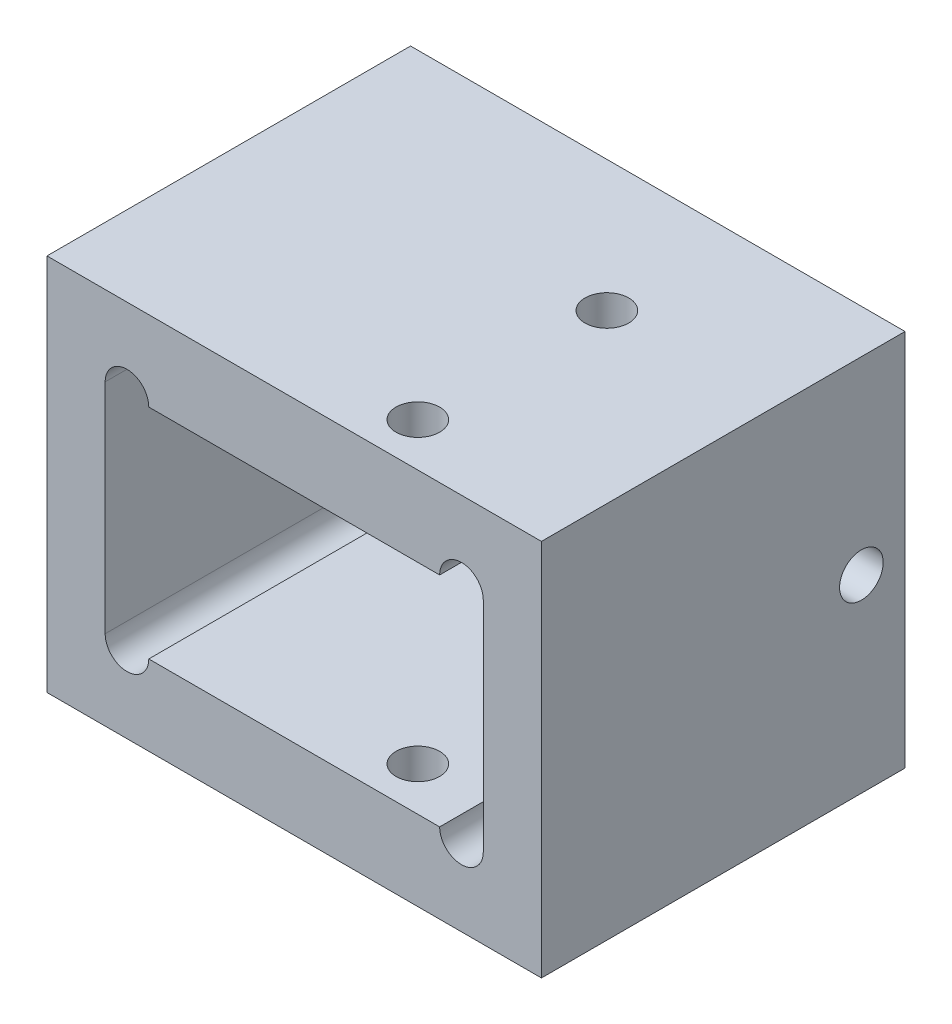
ISO-10303-21;
HEADER;
FILE_DESCRIPTION(('STEP AP214'),'2;1');
FILE_NAME('part.step','',(''),(''),'','','');
FILE_SCHEMA(('AUTOMOTIVE_DESIGN { 1 0 10303 214 1 1 1 1 }'));
ENDSEC;
DATA;
#1=APPLICATION_CONTEXT('core data for automotive mechanical design processes');
#2=APPLICATION_PROTOCOL_DEFINITION('international standard','automotive_design',2000,#1);
#3=PRODUCT_CONTEXT('',#1,'mechanical');
#4=PRODUCT('Part','Part','',(#3));
#5=PRODUCT_RELATED_PRODUCT_CATEGORY('part','',(#4));
#6=PRODUCT_DEFINITION_FORMATION('','',#4);
#7=PRODUCT_DEFINITION_CONTEXT('part definition',#1,'design');
#8=PRODUCT_DEFINITION('design','',#6,#7);
#9=PRODUCT_DEFINITION_SHAPE('','',#8);
#10=(LENGTH_UNIT() NAMED_UNIT(*) SI_UNIT(.MILLI.,.METRE.));
#11=(NAMED_UNIT(*) PLANE_ANGLE_UNIT() SI_UNIT($,.RADIAN.));
#12=(NAMED_UNIT(*) SI_UNIT($,.STERADIAN.) SOLID_ANGLE_UNIT());
#13=UNCERTAINTY_MEASURE_WITH_UNIT(LENGTH_MEASURE(1.E-05),#10,'distance_accuracy_value','');
#14=(GEOMETRIC_REPRESENTATION_CONTEXT(3) GLOBAL_UNCERTAINTY_ASSIGNED_CONTEXT((#13)) GLOBAL_UNIT_ASSIGNED_CONTEXT((#10,
#11,#12)) REPRESENTATION_CONTEXT('',''));
#15=CARTESIAN_POINT('',(0.,0.,0.));
#16=DIRECTION('',(0.,0.,1.));
#17=DIRECTION('',(1.,0.,0.));
#18=AXIS2_PLACEMENT_3D('',#15,#16,#17);
#19=CARTESIAN_POINT('',(0.,0.,25.));
#20=DIRECTION('',(0.,0.,-1.));
#21=DIRECTION('',(-1.,0.,0.));
#22=AXIS2_PLACEMENT_3D('',#19,#20,#21);
#23=PLANE('',#22);
#24=DIRECTION('',(-1.,0.,0.));
#25=VECTOR('',#24,1.);
#26=CARTESIAN_POINT('',(0.,13.,25.));
#27=LINE('',#26,#25);
#28=CARTESIAN_POINT('',(34.,13.,25.));
#29=VERTEX_POINT('',#28);
#30=CARTESIAN_POINT('',(0.,13.,25.));
#31=VERTEX_POINT('',#30);
#32=EDGE_CURVE('E192',#29,#31,#27,.T.);
#33=ORIENTED_EDGE('',*,*,#32,.T.);
#34=DIRECTION('',(0.,-1.,0.));
#35=VECTOR('',#34,1.);
#36=CARTESIAN_POINT('',(0.,-13.,25.));
#37=LINE('',#36,#35);
#38=CARTESIAN_POINT('',(0.,-13.,25.));
#39=VERTEX_POINT('',#38);
#40=EDGE_CURVE('E196',#31,#39,#37,.T.);
#41=ORIENTED_EDGE('',*,*,#40,.T.);
#42=DIRECTION('',(1.,0.,0.));
#43=VECTOR('',#42,1.);
#44=CARTESIAN_POINT('',(0.,-13.,25.));
#45=LINE('',#44,#43);
#46=CARTESIAN_POINT('',(34.,-13.,25.));
#47=VERTEX_POINT('',#46);
#48=EDGE_CURVE('E200',#39,#47,#45,.T.);
#49=ORIENTED_EDGE('',*,*,#48,.T.);
#50=DIRECTION('',(0.,1.,0.));
#51=VECTOR('',#50,1.);
#52=CARTESIAN_POINT('',(34.,13.,25.));
#53=LINE('',#52,#51);
#54=EDGE_CURVE('E203',#47,#29,#53,.T.);
#55=ORIENTED_EDGE('',*,*,#54,.T.);
#56=EDGE_LOOP('',(#33,#41,#49,#55));
#57=FACE_BOUND('',#56,.T.);
#58=DIRECTION('',(-1.,0.,0.));
#59=VECTOR('',#58,1.);
#60=CARTESIAN_POINT('',(4.,7.49999999999999,25.));
#61=LINE('',#60,#59);
#62=CARTESIAN_POINT('',(27.,7.49999999999999,25.));
#63=VERTEX_POINT('',#62);
#64=CARTESIAN_POINT('',(7.,7.49999999999999,25.));
#65=VERTEX_POINT('',#64);
#66=EDGE_CURVE('E157',#63,#65,#61,.T.);
#67=ORIENTED_EDGE('',*,*,#66,.F.);
#68=CARTESIAN_POINT('',(28.5,7.49999999999999,25.));
#69=DIRECTION('',(0.,0.,1.));
#70=DIRECTION('',(-1.,0.,0.));
#71=AXIS2_PLACEMENT_3D('',#68,#69,#70);
#72=CIRCLE('',#71,1.5);
#73=CARTESIAN_POINT('',(30.,7.49999999999999,25.));
#74=VERTEX_POINT('',#73);
#75=EDGE_CURVE('E58',#74,#63,#72,.T.);
#76=ORIENTED_EDGE('',*,*,#75,.F.);
#77=DIRECTION('',(0.,1.,0.));
#78=VECTOR('',#77,1.);
#79=CARTESIAN_POINT('',(30.,7.49999999999999,25.));
#80=LINE('',#79,#78);
#81=CARTESIAN_POINT('',(30.,-7.49999999999999,25.));
#82=VERTEX_POINT('',#81);
#83=EDGE_CURVE('E163',#82,#74,#80,.T.);
#84=ORIENTED_EDGE('',*,*,#83,.F.);
#85=CARTESIAN_POINT('',(28.5,-7.49999999999999,25.));
#86=DIRECTION('',(0.,0.,1.));
#87=DIRECTION('',(1.,0.,0.));
#88=AXIS2_PLACEMENT_3D('',#85,#86,#87);
#89=CIRCLE('',#88,1.5);
#90=CARTESIAN_POINT('',(27.,-7.49999999999999,25.));
#91=VERTEX_POINT('',#90);
#92=EDGE_CURVE('E275',#91,#82,#89,.T.);
#93=ORIENTED_EDGE('',*,*,#92,.F.);
#94=DIRECTION('',(1.,0.,0.));
#95=VECTOR('',#94,1.);
#96=CARTESIAN_POINT('',(4.,-7.49999999999999,25.));
#97=LINE('',#96,#95);
#98=CARTESIAN_POINT('',(7.,-7.49999999999999,25.));
#99=VERTEX_POINT('',#98);
#100=EDGE_CURVE('E150',#99,#91,#97,.T.);
#101=ORIENTED_EDGE('',*,*,#100,.F.);
#102=CARTESIAN_POINT('',(5.5,-7.49999999999999,25.));
#103=DIRECTION('',(0.,0.,1.));
#104=DIRECTION('',(-1.,0.,0.));
#105=AXIS2_PLACEMENT_3D('',#102,#103,#104);
#106=CIRCLE('',#105,1.5);
#107=CARTESIAN_POINT('',(4.,-7.49999999999999,25.));
#108=VERTEX_POINT('',#107);
#109=EDGE_CURVE('E66',#108,#99,#106,.T.);
#110=ORIENTED_EDGE('',*,*,#109,.F.);
#111=DIRECTION('',(0.,-1.,0.));
#112=VECTOR('',#111,1.);
#113=CARTESIAN_POINT('',(4.,-7.49999999999999,25.));
#114=LINE('',#113,#112);
#115=CARTESIAN_POINT('',(4.,7.49999999999999,25.));
#116=VERTEX_POINT('',#115);
#117=EDGE_CURVE('E147',#116,#108,#114,.T.);
#118=ORIENTED_EDGE('',*,*,#117,.F.);
#119=CARTESIAN_POINT('',(5.5,7.49999999999999,25.));
#120=DIRECTION('',(0.,0.,1.));
#121=DIRECTION('',(1.,0.,0.));
#122=AXIS2_PLACEMENT_3D('',#119,#120,#121);
#123=CIRCLE('',#122,1.5);
#124=EDGE_CURVE('E270',#65,#116,#123,.T.);
#125=ORIENTED_EDGE('',*,*,#124,.F.);
#126=EDGE_LOOP('',(#67,#76,#84,#93,#101,#110,#118,#125));
#127=FACE_BOUND('',#126,.T.);
#128=ADVANCED_FACE('F41',(#57,#127),#23,.F.);
#129=CARTESIAN_POINT('',(0.,0.,0.));
#130=DIRECTION('',(0.,0.,-1.));
#131=DIRECTION('',(-1.,0.,0.));
#132=AXIS2_PLACEMENT_3D('',#129,#130,#131);
#133=PLANE('',#132);
#134=CARTESIAN_POINT('',(28.5,7.49999999999999,0.));
#135=DIRECTION('',(0.,0.,1.));
#136=DIRECTION('',(-1.,0.,0.));
#137=AXIS2_PLACEMENT_3D('',#134,#135,#136);
#138=CIRCLE('',#137,1.5);
#139=CARTESIAN_POINT('',(30.,7.49999999999999,0.));
#140=VERTEX_POINT('',#139);
#141=CARTESIAN_POINT('',(27.,7.49999999999999,0.));
#142=VERTEX_POINT('',#141);
#143=EDGE_CURVE('E278',#140,#142,#138,.T.);
#144=ORIENTED_EDGE('',*,*,#143,.T.);
#145=DIRECTION('',(-1.,0.,0.));
#146=VECTOR('',#145,1.);
#147=CARTESIAN_POINT('',(4.,7.49999999999999,0.));
#148=LINE('',#147,#146);
#149=CARTESIAN_POINT('',(7.,7.49999999999999,0.));
#150=VERTEX_POINT('',#149);
#151=EDGE_CURVE('E171',#142,#150,#148,.T.);
#152=ORIENTED_EDGE('',*,*,#151,.T.);
#153=CARTESIAN_POINT('',(5.5,7.49999999999999,0.));
#154=DIRECTION('',(0.,0.,1.));
#155=DIRECTION('',(1.,0.,0.));
#156=AXIS2_PLACEMENT_3D('',#153,#154,#155);
#157=CIRCLE('',#156,1.5);
#158=CARTESIAN_POINT('',(4.,7.49999999999999,0.));
#159=VERTEX_POINT('',#158);
#160=EDGE_CURVE('E284',#150,#159,#157,.T.);
#161=ORIENTED_EDGE('',*,*,#160,.T.);
#162=DIRECTION('',(0.,-1.,0.));
#163=VECTOR('',#162,1.);
#164=CARTESIAN_POINT('',(4.,-7.49999999999999,0.));
#165=LINE('',#164,#163);
#166=CARTESIAN_POINT('',(4.,-7.49999999999999,0.));
#167=VERTEX_POINT('',#166);
#168=EDGE_CURVE('E176',#159,#167,#165,.T.);
#169=ORIENTED_EDGE('',*,*,#168,.T.);
#170=CARTESIAN_POINT('',(5.5,-7.49999999999999,0.));
#171=DIRECTION('',(0.,0.,1.));
#172=DIRECTION('',(-1.,0.,0.));
#173=AXIS2_PLACEMENT_3D('',#170,#171,#172);
#174=CIRCLE('',#173,1.5);
#175=CARTESIAN_POINT('',(7.,-7.49999999999999,0.));
#176=VERTEX_POINT('',#175);
#177=EDGE_CURVE('E133',#167,#176,#174,.T.);
#178=ORIENTED_EDGE('',*,*,#177,.T.);
#179=DIRECTION('',(1.,0.,0.));
#180=VECTOR('',#179,1.);
#181=CARTESIAN_POINT('',(4.,-7.49999999999999,0.));
#182=LINE('',#181,#180);
#183=CARTESIAN_POINT('',(27.,-7.49999999999999,0.));
#184=VERTEX_POINT('',#183);
#185=EDGE_CURVE('E179',#176,#184,#182,.T.);
#186=ORIENTED_EDGE('',*,*,#185,.T.);
#187=CARTESIAN_POINT('',(28.5,-7.49999999999999,0.));
#188=DIRECTION('',(0.,0.,1.));
#189=DIRECTION('',(1.,0.,0.));
#190=AXIS2_PLACEMENT_3D('',#187,#188,#189);
#191=CIRCLE('',#190,1.5);
#192=CARTESIAN_POINT('',(30.,-7.49999999999999,0.));
#193=VERTEX_POINT('',#192);
#194=EDGE_CURVE('E152',#184,#193,#191,.T.);
#195=ORIENTED_EDGE('',*,*,#194,.T.);
#196=DIRECTION('',(0.,1.,0.));
#197=VECTOR('',#196,1.);
#198=CARTESIAN_POINT('',(30.,7.49999999999999,0.));
#199=LINE('',#198,#197);
#200=EDGE_CURVE('E167',#193,#140,#199,.T.);
#201=ORIENTED_EDGE('',*,*,#200,.T.);
#202=EDGE_LOOP('',(#144,#152,#161,#169,#178,#186,#195,#201));
#203=FACE_BOUND('',#202,.T.);
#204=DIRECTION('',(-1.,0.,0.));
#205=VECTOR('',#204,1.);
#206=CARTESIAN_POINT('',(0.,13.,0.));
#207=LINE('',#206,#205);
#208=CARTESIAN_POINT('',(34.,13.,0.));
#209=VERTEX_POINT('',#208);
#210=CARTESIAN_POINT('',(0.,13.,0.));
#211=VERTEX_POINT('',#210);
#212=EDGE_CURVE('E191',#209,#211,#207,.T.);
#213=ORIENTED_EDGE('',*,*,#212,.F.);
#214=DIRECTION('',(0.,1.,0.));
#215=VECTOR('',#214,1.);
#216=CARTESIAN_POINT('',(34.,13.,0.));
#217=LINE('',#216,#215);
#218=CARTESIAN_POINT('',(34.,-13.,0.));
#219=VERTEX_POINT('',#218);
#220=EDGE_CURVE('E197',#219,#209,#217,.T.);
#221=ORIENTED_EDGE('',*,*,#220,.F.);
#222=DIRECTION('',(1.,0.,0.));
#223=VECTOR('',#222,1.);
#224=CARTESIAN_POINT('',(0.,-13.,0.));
#225=LINE('',#224,#223);
#226=CARTESIAN_POINT('',(0.,-13.,0.));
#227=VERTEX_POINT('',#226);
#228=EDGE_CURVE('E213',#227,#219,#225,.T.);
#229=ORIENTED_EDGE('',*,*,#228,.F.);
#230=DIRECTION('',(0.,-1.,0.));
#231=VECTOR('',#230,1.);
#232=CARTESIAN_POINT('',(0.,-13.,0.));
#233=LINE('',#232,#231);
#234=EDGE_CURVE('E210',#211,#227,#233,.T.);
#235=ORIENTED_EDGE('',*,*,#234,.F.);
#236=EDGE_LOOP('',(#213,#221,#229,#235));
#237=FACE_BOUND('',#236,.T.);
#238=ADVANCED_FACE('F304',(#203,#237),#133,.T.);
#239=CARTESIAN_POINT('',(0.,13.,25.));
#240=DIRECTION('',(0.,-1.,0.));
#241=DIRECTION('',(0.,0.,-1.));
#242=AXIS2_PLACEMENT_3D('',#239,#240,#241);
#243=PLANE('',#242);
#244=CARTESIAN_POINT('',(22.5,13.,22.));
#245=DIRECTION('',(0.,1.,0.));
#246=DIRECTION('',(0.,0.,1.));
#247=AXIS2_PLACEMENT_3D('',#244,#245,#246);
#248=CIRCLE('',#247,1.5);
#249=CARTESIAN_POINT('',(22.5,13.,23.5));
#250=VERTEX_POINT('',#249);
#251=EDGE_CURVE('E399',#250,#250,#248,.T.);
#252=ORIENTED_EDGE('',*,*,#251,.F.);
#253=EDGE_LOOP('',(#252));
#254=FACE_BOUND('',#253,.T.);
#255=CARTESIAN_POINT('',(22.5,13.,9.));
#256=DIRECTION('',(0.,1.,0.));
#257=DIRECTION('',(0.,0.,-1.));
#258=AXIS2_PLACEMENT_3D('',#255,#256,#257);
#259=CIRCLE('',#258,1.5);
#260=CARTESIAN_POINT('',(22.5,13.,7.5));
#261=VERTEX_POINT('',#260);
#262=EDGE_CURVE('E391',#261,#261,#259,.T.);
#263=ORIENTED_EDGE('',*,*,#262,.F.);
#264=EDGE_LOOP('',(#263));
#265=FACE_BOUND('',#264,.T.);
#266=ORIENTED_EDGE('',*,*,#212,.T.);
#267=DIRECTION('',(0.,0.,-1.));
#268=VECTOR('',#267,1.);
#269=CARTESIAN_POINT('',(0.,13.,25.));
#270=LINE('',#269,#268);
#271=EDGE_CURVE('E229',#31,#211,#270,.T.);
#272=ORIENTED_EDGE('',*,*,#271,.F.);
#273=ORIENTED_EDGE('',*,*,#32,.F.);
#274=DIRECTION('',(0.,0.,-1.));
#275=VECTOR('',#274,1.);
#276=CARTESIAN_POINT('',(34.,13.,25.));
#277=LINE('',#276,#275);
#278=EDGE_CURVE('E206',#29,#209,#277,.T.);
#279=ORIENTED_EDGE('',*,*,#278,.T.);
#280=EDGE_LOOP('',(#266,#272,#273,#279));
#281=FACE_BOUND('',#280,.T.);
#282=ADVANCED_FACE('F43',(#254,#265,#281),#243,.F.);
#283=CARTESIAN_POINT('',(0.,-13.,25.));
#284=DIRECTION('',(1.,0.,0.));
#285=DIRECTION('',(0.,0.,-1.));
#286=AXIS2_PLACEMENT_3D('',#283,#284,#285);
#287=PLANE('',#286);
#288=CARTESIAN_POINT('',(0.,0.,3.));
#289=DIRECTION('',(1.,0.,0.));
#290=DIRECTION('',(0.,0.,-1.));
#291=AXIS2_PLACEMENT_3D('',#288,#289,#290);
#292=CIRCLE('',#291,1.5);
#293=CARTESIAN_POINT('',(0.,0.,1.5));
#294=VERTEX_POINT('',#293);
#295=EDGE_CURVE('E351',#294,#294,#292,.T.);
#296=ORIENTED_EDGE('',*,*,#295,.T.);
#297=EDGE_LOOP('',(#296));
#298=FACE_BOUND('',#297,.T.);
#299=CARTESIAN_POINT('',(0.,0.,10.));
#300=DIRECTION('',(-1.,0.,0.));
#301=DIRECTION('',(0.,0.,1.));
#302=AXIS2_PLACEMENT_3D('',#299,#300,#301);
#303=CIRCLE('',#302,2.5);
#304=CARTESIAN_POINT('',(0.,0.,12.5));
#305=VERTEX_POINT('',#304);
#306=EDGE_CURVE('E252',#305,#305,#303,.T.);
#307=ORIENTED_EDGE('',*,*,#306,.F.);
#308=EDGE_LOOP('',(#307));
#309=FACE_BOUND('',#308,.T.);
#310=ORIENTED_EDGE('',*,*,#234,.T.);
#311=DIRECTION('',(0.,0.,-1.));
#312=VECTOR('',#311,1.);
#313=CARTESIAN_POINT('',(0.,-13.,25.));
#314=LINE('',#313,#312);
#315=EDGE_CURVE('E225',#39,#227,#314,.T.);
#316=ORIENTED_EDGE('',*,*,#315,.F.);
#317=ORIENTED_EDGE('',*,*,#40,.F.);
#318=ORIENTED_EDGE('',*,*,#271,.T.);
#319=EDGE_LOOP('',(#310,#316,#317,#318));
#320=FACE_BOUND('',#319,.T.);
#321=ADVANCED_FACE('F340',(#298,#309,#320),#287,.F.);
#322=CARTESIAN_POINT('',(0.,-13.,25.));
#323=DIRECTION('',(0.,1.,0.));
#324=DIRECTION('',(0.,0.,1.));
#325=AXIS2_PLACEMENT_3D('',#322,#323,#324);
#326=PLANE('',#325);
#327=CARTESIAN_POINT('',(22.5,-13.,22.));
#328=DIRECTION('',(0.,1.,0.));
#329=DIRECTION('',(0.,0.,1.));
#330=AXIS2_PLACEMENT_3D('',#327,#328,#329);
#331=CIRCLE('',#330,1.5);
#332=CARTESIAN_POINT('',(22.5,-13.,23.5));
#333=VERTEX_POINT('',#332);
#334=EDGE_CURVE('E242',#333,#333,#331,.T.);
#335=ORIENTED_EDGE('',*,*,#334,.T.);
#336=EDGE_LOOP('',(#335));
#337=FACE_BOUND('',#336,.T.);
#338=CARTESIAN_POINT('',(22.5,-13.,9.));
#339=DIRECTION('',(0.,1.,0.));
#340=DIRECTION('',(0.,0.,-1.));
#341=AXIS2_PLACEMENT_3D('',#338,#339,#340);
#342=CIRCLE('',#341,1.5);
#343=CARTESIAN_POINT('',(22.5,-13.,7.5));
#344=VERTEX_POINT('',#343);
#345=EDGE_CURVE('E259',#344,#344,#342,.T.);
#346=ORIENTED_EDGE('',*,*,#345,.T.);
#347=EDGE_LOOP('',(#346));
#348=FACE_BOUND('',#347,.T.);
#349=ORIENTED_EDGE('',*,*,#228,.T.);
#350=DIRECTION('',(0.,0.,-1.));
#351=VECTOR('',#350,1.);
#352=CARTESIAN_POINT('',(34.,-13.,25.));
#353=LINE('',#352,#351);
#354=EDGE_CURVE('E221',#47,#219,#353,.T.);
#355=ORIENTED_EDGE('',*,*,#354,.F.);
#356=ORIENTED_EDGE('',*,*,#48,.F.);
#357=ORIENTED_EDGE('',*,*,#315,.T.);
#358=EDGE_LOOP('',(#349,#355,#356,#357));
#359=FACE_BOUND('',#358,.T.);
#360=ADVANCED_FACE('F337',(#337,#348,#359),#326,.F.);
#361=CARTESIAN_POINT('',(34.,13.,25.));
#362=DIRECTION('',(-1.,0.,0.));
#363=DIRECTION('',(0.,0.,1.));
#364=AXIS2_PLACEMENT_3D('',#361,#362,#363);
#365=PLANE('',#364);
#366=CARTESIAN_POINT('',(34.,0.,3.));
#367=DIRECTION('',(1.,0.,0.));
#368=DIRECTION('',(0.,0.,-1.));
#369=AXIS2_PLACEMENT_3D('',#366,#367,#368);
#370=CIRCLE('',#369,1.5);
#371=CARTESIAN_POINT('',(34.,0.,1.5));
#372=VERTEX_POINT('',#371);
#373=EDGE_CURVE('E393',#372,#372,#370,.T.);
#374=ORIENTED_EDGE('',*,*,#373,.F.);
#375=EDGE_LOOP('',(#374));
#376=FACE_BOUND('',#375,.T.);
#377=ORIENTED_EDGE('',*,*,#220,.T.);
#378=ORIENTED_EDGE('',*,*,#278,.F.);
#379=ORIENTED_EDGE('',*,*,#54,.F.);
#380=ORIENTED_EDGE('',*,*,#354,.T.);
#381=EDGE_LOOP('',(#377,#378,#379,#380));
#382=FACE_BOUND('',#381,.T.);
#383=ADVANCED_FACE('F334',(#376,#382),#365,.F.);
#384=CARTESIAN_POINT('',(30.,7.49999999999999,25.));
#385=DIRECTION('',(-1.,0.,0.));
#386=DIRECTION('',(0.,0.,1.));
#387=AXIS2_PLACEMENT_3D('',#384,#385,#386);
#388=PLANE('',#387);
#389=CARTESIAN_POINT('',(30.,0.,3.));
#390=DIRECTION('',(-1.,0.,0.));
#391=DIRECTION('',(0.,0.,1.));
#392=AXIS2_PLACEMENT_3D('',#389,#390,#391);
#393=CIRCLE('',#392,1.5);
#394=CARTESIAN_POINT('',(30.,0.,4.5));
#395=VERTEX_POINT('',#394);
#396=EDGE_CURVE('E387',#395,#395,#393,.T.);
#397=ORIENTED_EDGE('',*,*,#396,.F.);
#398=EDGE_LOOP('',(#397));
#399=FACE_BOUND('',#398,.T.);
#400=ORIENTED_EDGE('',*,*,#200,.F.);
#401=DIRECTION('',(0.,0.,-1.));
#402=VECTOR('',#401,1.);
#403=CARTESIAN_POINT('',(30.,-7.49999999999999,25.));
#404=LINE('',#403,#402);
#405=EDGE_CURVE('E140',#82,#193,#404,.T.);
#406=ORIENTED_EDGE('',*,*,#405,.F.);
#407=ORIENTED_EDGE('',*,*,#83,.T.);
#408=DIRECTION('',(0.,0.,-1.));
#409=VECTOR('',#408,1.);
#410=CARTESIAN_POINT('',(30.,7.49999999999999,25.));
#411=LINE('',#410,#409);
#412=EDGE_CURVE('E187',#74,#140,#411,.T.);
#413=ORIENTED_EDGE('',*,*,#412,.T.);
#414=EDGE_LOOP('',(#400,#406,#407,#413));
#415=FACE_BOUND('',#414,.T.);
#416=ADVANCED_FACE('F297',(#399,#415),#388,.T.);
#417=CARTESIAN_POINT('',(4.,7.49999999999999,25.));
#418=DIRECTION('',(0.,-1.,0.));
#419=DIRECTION('',(0.,0.,-1.));
#420=AXIS2_PLACEMENT_3D('',#417,#418,#419);
#421=PLANE('',#420);
#422=CARTESIAN_POINT('',(22.5,7.49999999999999,22.));
#423=DIRECTION('',(0.,-1.,0.));
#424=DIRECTION('',(0.,0.,-1.));
#425=AXIS2_PLACEMENT_3D('',#422,#423,#424);
#426=CIRCLE('',#425,1.5);
#427=CARTESIAN_POINT('',(22.5,7.49999999999999,20.5));
#428=VERTEX_POINT('',#427);
#429=EDGE_CURVE('E246',#428,#428,#426,.T.);
#430=ORIENTED_EDGE('',*,*,#429,.F.);
#431=EDGE_LOOP('',(#430));
#432=FACE_BOUND('',#431,.T.);
#433=CARTESIAN_POINT('',(22.5,7.49999999999999,9.));
#434=DIRECTION('',(0.,-1.,0.));
#435=DIRECTION('',(0.,0.,-1.));
#436=AXIS2_PLACEMENT_3D('',#433,#434,#435);
#437=CIRCLE('',#436,1.5);
#438=CARTESIAN_POINT('',(22.5,7.49999999999999,7.5));
#439=VERTEX_POINT('',#438);
#440=EDGE_CURVE('E241',#439,#439,#437,.T.);
#441=ORIENTED_EDGE('',*,*,#440,.F.);
#442=EDGE_LOOP('',(#441));
#443=FACE_BOUND('',#442,.T.);
#444=DIRECTION('',(0.,0.,1.));
#445=VECTOR('',#444,1.);
#446=CARTESIAN_POINT('',(27.,7.49999999999999,0.));
#447=LINE('',#446,#445);
#448=EDGE_CURVE('E11',#63,#142,#447,.F.);
#449=ORIENTED_EDGE('',*,*,#448,.F.);
#450=ORIENTED_EDGE('',*,*,#66,.T.);
#451=DIRECTION('',(0.,0.,1.));
#452=VECTOR('',#451,1.);
#453=CARTESIAN_POINT('',(7.,7.49999999999999,0.));
#454=LINE('',#453,#452);
#455=EDGE_CURVE('E172',#150,#65,#454,.T.);
#456=ORIENTED_EDGE('',*,*,#455,.F.);
#457=ORIENTED_EDGE('',*,*,#151,.F.);
#458=EDGE_LOOP('',(#449,#450,#456,#457));
#459=FACE_BOUND('',#458,.T.);
#460=ADVANCED_FACE('F300',(#432,#443,#459),#421,.T.);
#461=CARTESIAN_POINT('',(4.,-7.49999999999999,25.));
#462=DIRECTION('',(1.,0.,0.));
#463=DIRECTION('',(0.,0.,-1.));
#464=AXIS2_PLACEMENT_3D('',#461,#462,#463);
#465=PLANE('',#464);
#466=CARTESIAN_POINT('',(4.,0.,3.));
#467=DIRECTION('',(1.,0.,0.));
#468=DIRECTION('',(0.,0.,-1.));
#469=AXIS2_PLACEMENT_3D('',#466,#467,#468);
#470=CIRCLE('',#469,1.5);
#471=CARTESIAN_POINT('',(4.,0.,1.5));
#472=VERTEX_POINT('',#471);
#473=EDGE_CURVE('E45',#472,#472,#470,.T.);
#474=ORIENTED_EDGE('',*,*,#473,.F.);
#475=EDGE_LOOP('',(#474));
#476=FACE_BOUND('',#475,.T.);
#477=CARTESIAN_POINT('',(4.,0.,10.));
#478=DIRECTION('',(1.,0.,0.));
#479=DIRECTION('',(0.,0.,-1.));
#480=AXIS2_PLACEMENT_3D('',#477,#478,#479);
#481=CIRCLE('',#480,2.5);
#482=CARTESIAN_POINT('',(4.,0.,7.5));
#483=VERTEX_POINT('',#482);
#484=EDGE_CURVE('E265',#483,#483,#481,.F.);
#485=ORIENTED_EDGE('',*,*,#484,.T.);
#486=EDGE_LOOP('',(#485));
#487=FACE_BOUND('',#486,.T.);
#488=ORIENTED_EDGE('',*,*,#168,.F.);
#489=DIRECTION('',(0.,0.,-1.));
#490=VECTOR('',#489,1.);
#491=CARTESIAN_POINT('',(4.,7.49999999999999,25.));
#492=LINE('',#491,#490);
#493=EDGE_CURVE('E139',#116,#159,#492,.T.);
#494=ORIENTED_EDGE('',*,*,#493,.F.);
#495=ORIENTED_EDGE('',*,*,#117,.T.);
#496=DIRECTION('',(0.,0.,-1.));
#497=VECTOR('',#496,1.);
#498=CARTESIAN_POINT('',(4.,-7.49999999999999,25.));
#499=LINE('',#498,#497);
#500=EDGE_CURVE('E130',#108,#167,#499,.T.);
#501=ORIENTED_EDGE('',*,*,#500,.T.);
#502=EDGE_LOOP('',(#488,#494,#495,#501));
#503=FACE_BOUND('',#502,.T.);
#504=ADVANCED_FACE('F155',(#476,#487,#503),#465,.T.);
#505=CARTESIAN_POINT('',(4.,-7.49999999999999,25.));
#506=DIRECTION('',(0.,1.,0.));
#507=DIRECTION('',(0.,0.,1.));
#508=AXIS2_PLACEMENT_3D('',#505,#506,#507);
#509=PLANE('',#508);
#510=CARTESIAN_POINT('',(22.5,-7.49999999999999,22.));
#511=DIRECTION('',(0.,1.,0.));
#512=DIRECTION('',(0.,0.,1.));
#513=AXIS2_PLACEMENT_3D('',#510,#511,#512);
#514=CIRCLE('',#513,1.5);
#515=CARTESIAN_POINT('',(22.5,-7.49999999999999,23.5));
#516=VERTEX_POINT('',#515);
#517=EDGE_CURVE('E243',#516,#516,#514,.T.);
#518=ORIENTED_EDGE('',*,*,#517,.F.);
#519=EDGE_LOOP('',(#518));
#520=FACE_BOUND('',#519,.T.);
#521=CARTESIAN_POINT('',(22.5,-7.49999999999999,9.));
#522=DIRECTION('',(0.,1.,0.));
#523=DIRECTION('',(0.,0.,1.));
#524=AXIS2_PLACEMENT_3D('',#521,#522,#523);
#525=CIRCLE('',#524,1.5);
#526=CARTESIAN_POINT('',(22.5,-7.49999999999999,10.5));
#527=VERTEX_POINT('',#526);
#528=EDGE_CURVE('E238',#527,#527,#525,.T.);
#529=ORIENTED_EDGE('',*,*,#528,.F.);
#530=EDGE_LOOP('',(#529));
#531=FACE_BOUND('',#530,.T.);
#532=DIRECTION('',(0.,0.,1.));
#533=VECTOR('',#532,1.);
#534=CARTESIAN_POINT('',(27.,-7.49999999999999,0.));
#535=LINE('',#534,#533);
#536=EDGE_CURVE('E51',#184,#91,#535,.T.);
#537=ORIENTED_EDGE('',*,*,#536,.F.);
#538=ORIENTED_EDGE('',*,*,#185,.F.);
#539=DIRECTION('',(0.,0.,1.));
#540=VECTOR('',#539,1.);
#541=CARTESIAN_POINT('',(7.,-7.49999999999999,0.));
#542=LINE('',#541,#540);
#543=EDGE_CURVE('E233',#99,#176,#542,.F.);
#544=ORIENTED_EDGE('',*,*,#543,.F.);
#545=ORIENTED_EDGE('',*,*,#100,.T.);
#546=EDGE_LOOP('',(#537,#538,#544,#545));
#547=FACE_BOUND('',#546,.T.);
#548=ADVANCED_FACE('F311',(#520,#531,#547),#509,.T.);
#549=CARTESIAN_POINT('',(5.5,-7.49999999999999,0.));
#550=DIRECTION('',(0.,0.,1.));
#551=DIRECTION('',(1.,0.,0.));
#552=AXIS2_PLACEMENT_3D('',#549,#550,#551);
#553=CYLINDRICAL_SURFACE('',#552,1.5);
#554=ORIENTED_EDGE('',*,*,#500,.F.);
#555=ORIENTED_EDGE('',*,*,#109,.T.);
#556=ORIENTED_EDGE('',*,*,#543,.T.);
#557=ORIENTED_EDGE('',*,*,#177,.F.);
#558=EDGE_LOOP('',(#554,#555,#556,#557));
#559=FACE_BOUND('',#558,.T.);
#560=ADVANCED_FACE('F131',(#559),#553,.F.);
#561=CARTESIAN_POINT('',(28.5,-7.49999999999999,0.));
#562=DIRECTION('',(0.,0.,1.));
#563=DIRECTION('',(1.,0.,0.));
#564=AXIS2_PLACEMENT_3D('',#561,#562,#563);
#565=CYLINDRICAL_SURFACE('',#564,1.5);
#566=ORIENTED_EDGE('',*,*,#536,.T.);
#567=ORIENTED_EDGE('',*,*,#92,.T.);
#568=ORIENTED_EDGE('',*,*,#405,.T.);
#569=ORIENTED_EDGE('',*,*,#194,.F.);
#570=EDGE_LOOP('',(#566,#567,#568,#569));
#571=FACE_BOUND('',#570,.T.);
#572=ADVANCED_FACE('F309',(#571),#565,.F.);
#573=CARTESIAN_POINT('',(5.5,7.49999999999999,0.));
#574=DIRECTION('',(0.,0.,1.));
#575=DIRECTION('',(1.,0.,0.));
#576=AXIS2_PLACEMENT_3D('',#573,#574,#575);
#577=CYLINDRICAL_SURFACE('',#576,1.5);
#578=ORIENTED_EDGE('',*,*,#455,.T.);
#579=ORIENTED_EDGE('',*,*,#124,.T.);
#580=ORIENTED_EDGE('',*,*,#493,.T.);
#581=ORIENTED_EDGE('',*,*,#160,.F.);
#582=EDGE_LOOP('',(#578,#579,#580,#581));
#583=FACE_BOUND('',#582,.T.);
#584=ADVANCED_FACE('F313',(#583),#577,.F.);
#585=CARTESIAN_POINT('',(28.5,7.49999999999999,0.));
#586=DIRECTION('',(0.,0.,1.));
#587=DIRECTION('',(1.,0.,0.));
#588=AXIS2_PLACEMENT_3D('',#585,#586,#587);
#589=CYLINDRICAL_SURFACE('',#588,1.5);
#590=ORIENTED_EDGE('',*,*,#412,.F.);
#591=ORIENTED_EDGE('',*,*,#75,.T.);
#592=ORIENTED_EDGE('',*,*,#448,.T.);
#593=ORIENTED_EDGE('',*,*,#143,.F.);
#594=EDGE_LOOP('',(#590,#591,#592,#593));
#595=FACE_BOUND('',#594,.T.);
#596=ADVANCED_FACE('F302',(#595),#589,.F.);
#597=CARTESIAN_POINT('',(11.0710678118655,0.,10.));
#598=DIRECTION('',(-1.,0.,0.));
#599=DIRECTION('',(0.,0.,1.));
#600=AXIS2_PLACEMENT_3D('',#597,#598,#599);
#601=CYLINDRICAL_SURFACE('',#600,2.5);
#602=ORIENTED_EDGE('',*,*,#306,.T.);
#603=EDGE_LOOP('',(#602));
#604=FACE_BOUND('',#603,.T.);
#605=ORIENTED_EDGE('',*,*,#484,.F.);
#606=EDGE_LOOP('',(#605));
#607=FACE_BOUND('',#606,.T.);
#608=ADVANCED_FACE('F320',(#604,#607),#601,.F.);
#609=CARTESIAN_POINT('',(22.5,-13.,9.));
#610=DIRECTION('',(0.,1.,0.));
#611=DIRECTION('',(0.,0.,1.));
#612=AXIS2_PLACEMENT_3D('',#609,#610,#611);
#613=CYLINDRICAL_SURFACE('',#612,1.5);
#614=ORIENTED_EDGE('',*,*,#528,.T.);
#615=EDGE_LOOP('',(#614));
#616=FACE_BOUND('',#615,.T.);
#617=ORIENTED_EDGE('',*,*,#345,.F.);
#618=EDGE_LOOP('',(#617));
#619=FACE_BOUND('',#618,.T.);
#620=ADVANCED_FACE('F370',(#616,#619),#613,.F.);
#621=CARTESIAN_POINT('',(22.5,-13.,22.));
#622=DIRECTION('',(0.,1.,0.));
#623=DIRECTION('',(0.,0.,1.));
#624=AXIS2_PLACEMENT_3D('',#621,#622,#623);
#625=CYLINDRICAL_SURFACE('',#624,1.5);
#626=ORIENTED_EDGE('',*,*,#517,.T.);
#627=EDGE_LOOP('',(#626));
#628=FACE_BOUND('',#627,.T.);
#629=ORIENTED_EDGE('',*,*,#334,.F.);
#630=EDGE_LOOP('',(#629));
#631=FACE_BOUND('',#630,.T.);
#632=ADVANCED_FACE('F415',(#628,#631),#625,.F.);
#633=ORIENTED_EDGE('',*,*,#440,.T.);
#634=EDGE_LOOP('',(#633));
#635=FACE_BOUND('',#634,.T.);
#636=ORIENTED_EDGE('',*,*,#262,.T.);
#637=EDGE_LOOP('',(#636));
#638=FACE_BOUND('',#637,.T.);
#639=ADVANCED_FACE('F418',(#635,#638),#613,.F.);
#640=ORIENTED_EDGE('',*,*,#429,.T.);
#641=EDGE_LOOP('',(#640));
#642=FACE_BOUND('',#641,.T.);
#643=ORIENTED_EDGE('',*,*,#251,.T.);
#644=EDGE_LOOP('',(#643));
#645=FACE_BOUND('',#644,.T.);
#646=ADVANCED_FACE('F423',(#642,#645),#625,.F.);
#647=CARTESIAN_POINT('',(0.,0.,3.));
#648=DIRECTION('',(1.,0.,0.));
#649=DIRECTION('',(0.,0.,-1.));
#650=AXIS2_PLACEMENT_3D('',#647,#648,#649);
#651=CYLINDRICAL_SURFACE('',#650,1.5);
#652=ORIENTED_EDGE('',*,*,#473,.T.);
#653=EDGE_LOOP('',(#652));
#654=FACE_BOUND('',#653,.T.);
#655=ORIENTED_EDGE('',*,*,#295,.F.);
#656=EDGE_LOOP('',(#655));
#657=FACE_BOUND('',#656,.T.);
#658=ADVANCED_FACE('F428',(#654,#657),#651,.F.);
#659=ORIENTED_EDGE('',*,*,#396,.T.);
#660=EDGE_LOOP('',(#659));
#661=FACE_BOUND('',#660,.T.);
#662=ORIENTED_EDGE('',*,*,#373,.T.);
#663=EDGE_LOOP('',(#662));
#664=FACE_BOUND('',#663,.T.);
#665=ADVANCED_FACE('F433',(#661,#664),#651,.F.);
#666=CLOSED_SHELL('',(#128,#238,#282,#321,#360,#383,#416,#460,#504,#548,#560,#572,#584,#596,
#608,#620,#632,#639,#646,#658,#665));
#667=MANIFOLD_SOLID_BREP('B2',#666);
#668=ADVANCED_BREP_SHAPE_REPRESENTATION('',(#18,#667),#14);
#669=SHAPE_DEFINITION_REPRESENTATION(#9,#668);
ENDSEC;
END-ISO-10303-21;
